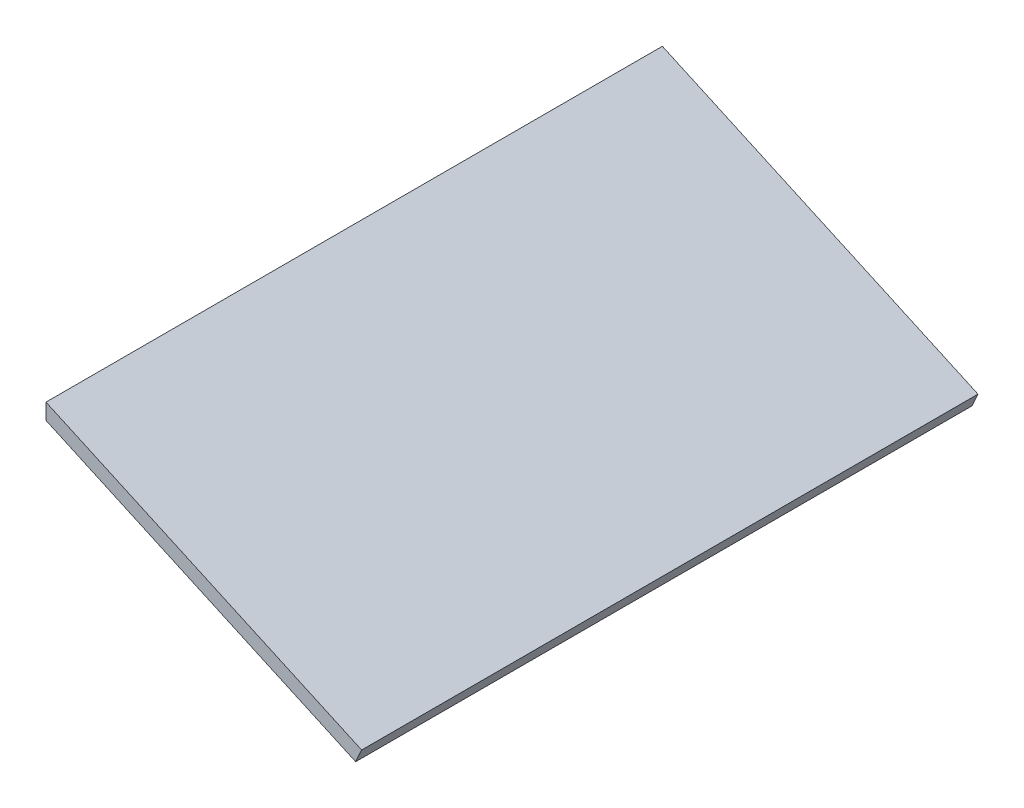
ISO-10303-21;
HEADER;
FILE_DESCRIPTION(('STEP AP214'),'2;1');
FILE_NAME('part.step','',(''),(''),'','','');
FILE_SCHEMA(('AUTOMOTIVE_DESIGN { 1 0 10303 214 1 1 1 1 }'));
ENDSEC;
DATA;
#1=APPLICATION_CONTEXT('core data for automotive mechanical design processes');
#2=APPLICATION_PROTOCOL_DEFINITION('international standard','automotive_design',2000,#1);
#3=PRODUCT_CONTEXT('',#1,'mechanical');
#4=PRODUCT('Part','Part','',(#3));
#5=PRODUCT_RELATED_PRODUCT_CATEGORY('part','',(#4));
#6=PRODUCT_DEFINITION_FORMATION('','',#4);
#7=PRODUCT_DEFINITION_CONTEXT('part definition',#1,'design');
#8=PRODUCT_DEFINITION('design','',#6,#7);
#9=PRODUCT_DEFINITION_SHAPE('','',#8);
#10=(LENGTH_UNIT() NAMED_UNIT(*) SI_UNIT(.MILLI.,.METRE.));
#11=(NAMED_UNIT(*) PLANE_ANGLE_UNIT() SI_UNIT($,.RADIAN.));
#12=(NAMED_UNIT(*) SI_UNIT($,.STERADIAN.) SOLID_ANGLE_UNIT());
#13=UNCERTAINTY_MEASURE_WITH_UNIT(LENGTH_MEASURE(1.E-05),#10,'distance_accuracy_value','');
#14=(GEOMETRIC_REPRESENTATION_CONTEXT(3) GLOBAL_UNCERTAINTY_ASSIGNED_CONTEXT((#13)) GLOBAL_UNIT_ASSIGNED_CONTEXT((#10,
#11,#12)) REPRESENTATION_CONTEXT('',''));
#15=CARTESIAN_POINT('',(0.,0.,0.));
#16=DIRECTION('',(0.,0.,1.));
#17=DIRECTION('',(1.,0.,0.));
#18=AXIS2_PLACEMENT_3D('',#15,#16,#17);
#19=CARTESIAN_POINT('',(-737.184498249528,1692.9410335188,812.8));
#20=DIRECTION('',(-0.413802944301184,-0.910366477462605,0.));
#21=DIRECTION('',(0.910366477462605,-0.413802944301184,0.));
#22=AXIS2_PLACEMENT_3D('',#19,#20,#21);
#23=PLANE('',#22);
#24=DIRECTION('',(-0.910366477462605,0.413802944301183,0.));
#25=VECTOR('',#24,1.);
#26=CARTESIAN_POINT('',(-737.184498249528,1692.9410335188,0.));
#27=LINE('',#26,#25);
#28=CARTESIAN_POINT('',(-320.964944753625,1503.7503273843,0.));
#29=VERTEX_POINT('',#28);
#30=CARTESIAN_POINT('',(-737.184498249528,1692.9410335188,0.));
#31=VERTEX_POINT('',#30);
#32=EDGE_CURVE('E98',#29,#31,#27,.T.);
#33=ORIENTED_EDGE('',*,*,#32,.T.);
#34=DIRECTION('',(0.,0.,-1.));
#35=VECTOR('',#34,1.);
#36=CARTESIAN_POINT('',(-737.184498249528,1692.9410335188,812.8));
#37=LINE('',#36,#35);
#38=CARTESIAN_POINT('',(-737.184498249528,1692.9410335188,812.8));
#39=VERTEX_POINT('',#38);
#40=EDGE_CURVE('E11',#39,#31,#37,.T.);
#41=ORIENTED_EDGE('',*,*,#40,.F.);
#42=DIRECTION('',(-0.910366477462605,0.413802944301183,0.));
#43=VECTOR('',#42,1.);
#44=CARTESIAN_POINT('',(-737.184498249528,1692.9410335188,812.8));
#45=LINE('',#44,#43);
#46=CARTESIAN_POINT('',(-320.964944753625,1503.7503273843,812.8));
#47=VERTEX_POINT('',#46);
#48=EDGE_CURVE('E86',#47,#39,#45,.T.);
#49=ORIENTED_EDGE('',*,*,#48,.F.);
#50=DIRECTION('',(0.,0.,-1.));
#51=VECTOR('',#50,1.);
#52=CARTESIAN_POINT('',(-320.964944753625,1503.7503273843,812.8));
#53=LINE('',#52,#51);
#54=EDGE_CURVE('E94',#47,#29,#53,.T.);
#55=ORIENTED_EDGE('',*,*,#54,.T.);
#56=EDGE_LOOP('',(#33,#41,#49,#55));
#57=FACE_BOUND('',#56,.T.);
#58=ADVANCED_FACE('F35',(#57),#23,.F.);
#59=CARTESIAN_POINT('',(-737.184498249528,1672.01539480998,812.8));
#60=DIRECTION('',(1.,0.,0.));
#61=DIRECTION('',(0.,0.,-1.));
#62=AXIS2_PLACEMENT_3D('',#59,#60,#61);
#63=PLANE('',#62);
#64=DIRECTION('',(0.,-1.,0.));
#65=VECTOR('',#64,1.);
#66=CARTESIAN_POINT('',(-737.184498249528,1672.01539480998,0.));
#67=LINE('',#66,#65);
#68=CARTESIAN_POINT('',(-737.184498249528,1672.01539480998,0.));
#69=VERTEX_POINT('',#68);
#70=EDGE_CURVE('E90',#31,#69,#67,.T.);
#71=ORIENTED_EDGE('',*,*,#70,.T.);
#72=DIRECTION('',(0.,0.,-1.));
#73=VECTOR('',#72,1.);
#74=CARTESIAN_POINT('',(-737.184498249528,1672.01539480998,812.8));
#75=LINE('',#74,#73);
#76=CARTESIAN_POINT('',(-737.184498249528,1672.01539480998,812.8));
#77=VERTEX_POINT('',#76);
#78=EDGE_CURVE('E43',#77,#69,#75,.T.);
#79=ORIENTED_EDGE('',*,*,#78,.F.);
#80=DIRECTION('',(0.,-1.,0.));
#81=VECTOR('',#80,1.);
#82=CARTESIAN_POINT('',(-737.184498249528,1672.01539480998,812.8));
#83=LINE('',#82,#81);
#84=EDGE_CURVE('E81',#39,#77,#83,.T.);
#85=ORIENTED_EDGE('',*,*,#84,.F.);
#86=ORIENTED_EDGE('',*,*,#40,.T.);
#87=EDGE_LOOP('',(#71,#79,#85,#86));
#88=FACE_BOUND('',#87,.T.);
#89=ADVANCED_FACE('F89',(#88),#63,.F.);
#90=CARTESIAN_POINT('',(-737.184498249528,1672.01539480998,812.8));
#91=DIRECTION('',(0.413802944301182,0.910366477462606,0.));
#92=DIRECTION('',(-0.910366477462606,0.413802944301182,0.));
#93=AXIS2_PLACEMENT_3D('',#90,#91,#92);
#94=PLANE('',#93);
#95=DIRECTION('',(0.910366477462606,-0.413802944301182,0.));
#96=VECTOR('',#95,1.);
#97=CARTESIAN_POINT('',(-737.184498249528,1672.01539480998,0.));
#98=LINE('',#97,#96);
#99=CARTESIAN_POINT('',(-328.847890842563,1486.40784598863,0.));
#100=VERTEX_POINT('',#99);
#101=EDGE_CURVE('E68',#69,#100,#98,.T.);
#102=ORIENTED_EDGE('',*,*,#101,.T.);
#103=DIRECTION('',(0.,0.,-1.));
#104=VECTOR('',#103,1.);
#105=CARTESIAN_POINT('',(-328.847890842563,1486.40784598863,812.8));
#106=LINE('',#105,#104);
#107=CARTESIAN_POINT('',(-328.847890842563,1486.40784598863,812.8));
#108=VERTEX_POINT('',#107);
#109=EDGE_CURVE('E91',#108,#100,#106,.T.);
#110=ORIENTED_EDGE('',*,*,#109,.F.);
#111=DIRECTION('',(0.910366477462606,-0.413802944301182,0.));
#112=VECTOR('',#111,1.);
#113=CARTESIAN_POINT('',(-737.184498249528,1672.01539480998,812.8));
#114=LINE('',#113,#112);
#115=EDGE_CURVE('E84',#77,#108,#114,.T.);
#116=ORIENTED_EDGE('',*,*,#115,.F.);
#117=ORIENTED_EDGE('',*,*,#78,.T.);
#118=EDGE_LOOP('',(#102,#110,#116,#117));
#119=FACE_BOUND('',#118,.T.);
#120=ADVANCED_FACE('F92',(#119),#94,.F.);
#121=CARTESIAN_POINT('',(-320.964944753625,1503.7503273843,812.8));
#122=DIRECTION('',(-0.910366477462606,0.413802944301181,0.));
#123=DIRECTION('',(-0.413802944301181,-0.910366477462606,0.));
#124=AXIS2_PLACEMENT_3D('',#121,#122,#123);
#125=PLANE('',#124);
#126=DIRECTION('',(0.413802944301181,0.910366477462606,0.));
#127=VECTOR('',#126,1.);
#128=CARTESIAN_POINT('',(-320.964944753625,1503.7503273843,0.));
#129=LINE('',#128,#127);
#130=EDGE_CURVE('E74',#100,#29,#129,.T.);
#131=ORIENTED_EDGE('',*,*,#130,.T.);
#132=ORIENTED_EDGE('',*,*,#54,.F.);
#133=DIRECTION('',(0.413802944301181,0.910366477462606,0.));
#134=VECTOR('',#133,1.);
#135=CARTESIAN_POINT('',(-320.964944753625,1503.7503273843,812.8));
#136=LINE('',#135,#134);
#137=EDGE_CURVE('E51',#108,#47,#136,.T.);
#138=ORIENTED_EDGE('',*,*,#137,.F.);
#139=ORIENTED_EDGE('',*,*,#109,.T.);
#140=EDGE_LOOP('',(#131,#132,#138,#139));
#141=FACE_BOUND('',#140,.T.);
#142=ADVANCED_FACE('F105',(#141),#125,.F.);
#143=CARTESIAN_POINT('',(0.,0.,812.8));
#144=DIRECTION('',(0.,0.,-1.));
#145=DIRECTION('',(-1.,0.,0.));
#146=AXIS2_PLACEMENT_3D('',#143,#144,#145);
#147=PLANE('',#146);
#148=ORIENTED_EDGE('',*,*,#48,.T.);
#149=ORIENTED_EDGE('',*,*,#84,.T.);
#150=ORIENTED_EDGE('',*,*,#115,.T.);
#151=ORIENTED_EDGE('',*,*,#137,.T.);
#152=EDGE_LOOP('',(#148,#149,#150,#151));
#153=FACE_BOUND('',#152,.T.);
#154=ADVANCED_FACE('F82',(#153),#147,.F.);
#155=CARTESIAN_POINT('',(0.,0.,0.));
#156=DIRECTION('',(0.,0.,-1.));
#157=DIRECTION('',(-1.,0.,0.));
#158=AXIS2_PLACEMENT_3D('',#155,#156,#157);
#159=PLANE('',#158);
#160=ORIENTED_EDGE('',*,*,#32,.F.);
#161=ORIENTED_EDGE('',*,*,#130,.F.);
#162=ORIENTED_EDGE('',*,*,#101,.F.);
#163=ORIENTED_EDGE('',*,*,#70,.F.);
#164=EDGE_LOOP('',(#160,#161,#162,#163));
#165=FACE_BOUND('',#164,.T.);
#166=ADVANCED_FACE('F108',(#165),#159,.T.);
#167=CLOSED_SHELL('',(#58,#89,#120,#142,#154,#166));
#168=MANIFOLD_SOLID_BREP('B2',#167);
#169=ADVANCED_BREP_SHAPE_REPRESENTATION('',(#18,#168),#14);
#170=SHAPE_DEFINITION_REPRESENTATION(#9,#169);
ENDSEC;
END-ISO-10303-21;
